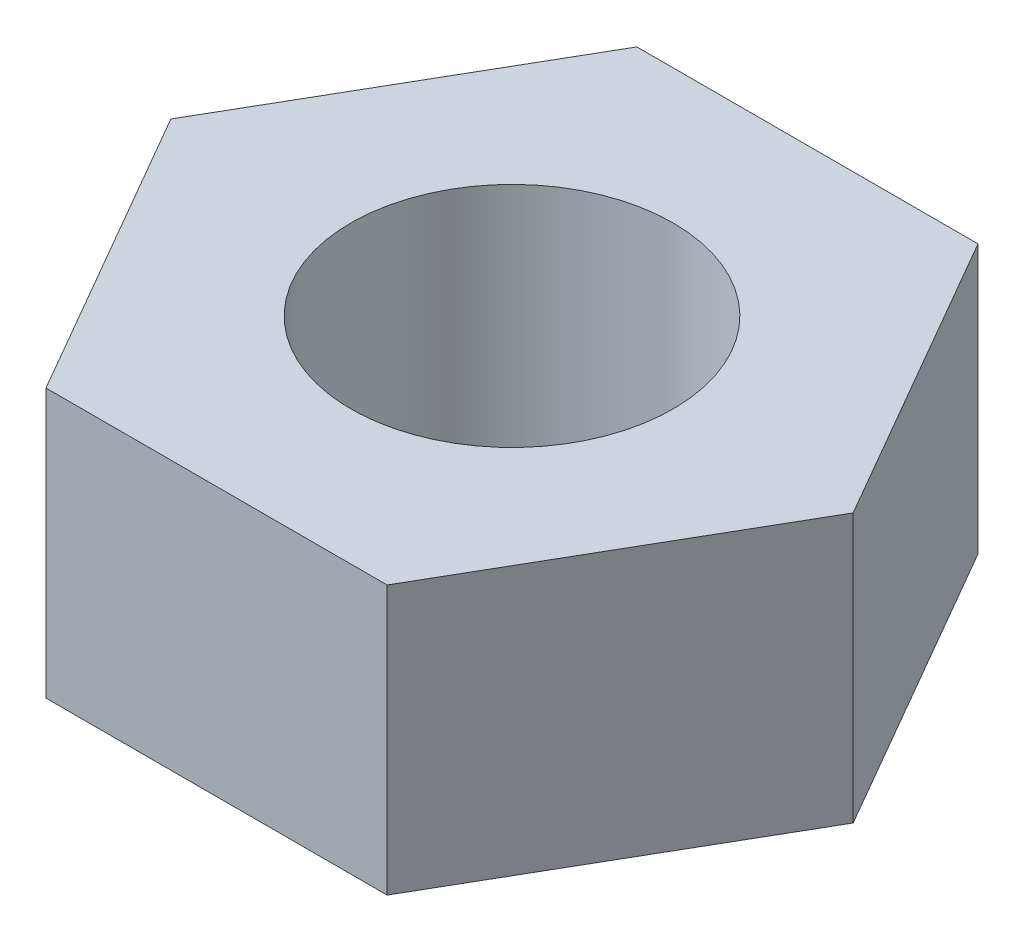
ISO-10303-21;
HEADER;
FILE_DESCRIPTION(('STEP AP214'),'2;1');
FILE_NAME('part.step','',(''),(''),'','','');
FILE_SCHEMA(('AUTOMOTIVE_DESIGN { 1 0 10303 214 1 1 1 1 }'));
ENDSEC;
DATA;
#1=APPLICATION_CONTEXT('core data for automotive mechanical design processes');
#2=APPLICATION_PROTOCOL_DEFINITION('international standard','automotive_design',2000,#1);
#3=PRODUCT_CONTEXT('',#1,'mechanical');
#4=PRODUCT('Part','Part','',(#3));
#5=PRODUCT_RELATED_PRODUCT_CATEGORY('part','',(#4));
#6=PRODUCT_DEFINITION_FORMATION('','',#4);
#7=PRODUCT_DEFINITION_CONTEXT('part definition',#1,'design');
#8=PRODUCT_DEFINITION('design','',#6,#7);
#9=PRODUCT_DEFINITION_SHAPE('','',#8);
#10=(LENGTH_UNIT() NAMED_UNIT(*) SI_UNIT(.MILLI.,.METRE.));
#11=(NAMED_UNIT(*) PLANE_ANGLE_UNIT() SI_UNIT($,.RADIAN.));
#12=(NAMED_UNIT(*) SI_UNIT($,.STERADIAN.) SOLID_ANGLE_UNIT());
#13=UNCERTAINTY_MEASURE_WITH_UNIT(LENGTH_MEASURE(1.E-05),#10,'distance_accuracy_value','');
#14=(GEOMETRIC_REPRESENTATION_CONTEXT(3) GLOBAL_UNCERTAINTY_ASSIGNED_CONTEXT((#13)) GLOBAL_UNIT_ASSIGNED_CONTEXT((#10,
#11,#12)) REPRESENTATION_CONTEXT('',''));
#15=CARTESIAN_POINT('',(0.,0.,0.));
#16=DIRECTION('',(0.,0.,1.));
#17=DIRECTION('',(1.,0.,0.));
#18=AXIS2_PLACEMENT_3D('',#15,#16,#17);
#19=CARTESIAN_POINT('',(1.5877132402715,2.5,2.74999999999998));
#20=DIRECTION('',(-0.866025403784442,0.,-0.499999999999995));
#21=DIRECTION('',(-0.499999999999995,0.,0.866025403784442));
#22=AXIS2_PLACEMENT_3D('',#19,#20,#21);
#23=PLANE('',#22);
#24=DIRECTION('',(0.499999999999995,0.,-0.866025403784441));
#25=VECTOR('',#24,1.);
#26=CARTESIAN_POINT('',(1.5877132402715,0.,2.74999999999998));
#27=LINE('',#26,#25);
#28=CARTESIAN_POINT('',(1.5877132402715,0.,2.74999999999998));
#29=VERTEX_POINT('',#28);
#30=CARTESIAN_POINT('',(3.17542648054294,0.,0.));
#31=VERTEX_POINT('',#30);
#32=EDGE_CURVE('E132',#29,#31,#27,.T.);
#33=ORIENTED_EDGE('',*,*,#32,.T.);
#34=DIRECTION('',(0.,-1.,0.));
#35=VECTOR('',#34,1.);
#36=CARTESIAN_POINT('',(3.17542648054294,2.5,0.));
#37=LINE('',#36,#35);
#38=CARTESIAN_POINT('',(3.17542648054294,2.5,0.));
#39=VERTEX_POINT('',#38);
#40=EDGE_CURVE('E11',#39,#31,#37,.T.);
#41=ORIENTED_EDGE('',*,*,#40,.F.);
#42=DIRECTION('',(0.499999999999995,0.,-0.866025403784441));
#43=VECTOR('',#42,1.);
#44=CARTESIAN_POINT('',(1.5877132402715,2.5,2.74999999999998));
#45=LINE('',#44,#43);
#46=CARTESIAN_POINT('',(1.5877132402715,2.5,2.74999999999998));
#47=VERTEX_POINT('',#46);
#48=EDGE_CURVE('E149',#47,#39,#45,.T.);
#49=ORIENTED_EDGE('',*,*,#48,.F.);
#50=DIRECTION('',(0.,-1.,0.));
#51=VECTOR('',#50,1.);
#52=CARTESIAN_POINT('',(1.5877132402715,2.5,2.74999999999998));
#53=LINE('',#52,#51);
#54=EDGE_CURVE('E128',#47,#29,#53,.T.);
#55=ORIENTED_EDGE('',*,*,#54,.T.);
#56=EDGE_LOOP('',(#33,#41,#49,#55));
#57=FACE_BOUND('',#56,.T.);
#58=ADVANCED_FACE('F43',(#57),#23,.F.);
#59=CARTESIAN_POINT('',(3.17542648054294,2.5,0.));
#60=DIRECTION('',(-0.866025403784438,0.,0.500000000000001));
#61=DIRECTION('',(0.500000000000001,0.,0.866025403784438));
#62=AXIS2_PLACEMENT_3D('',#59,#60,#61);
#63=PLANE('',#62);
#64=DIRECTION('',(-0.500000000000001,0.,-0.866025403784438));
#65=VECTOR('',#64,1.);
#66=CARTESIAN_POINT('',(3.17542648054294,0.,0.));
#67=LINE('',#66,#65);
#68=CARTESIAN_POINT('',(1.58771324027147,0.,-2.75000000000001));
#69=VERTEX_POINT('',#68);
#70=EDGE_CURVE('E136',#31,#69,#67,.T.);
#71=ORIENTED_EDGE('',*,*,#70,.T.);
#72=DIRECTION('',(0.,-1.,0.));
#73=VECTOR('',#72,1.);
#74=CARTESIAN_POINT('',(1.58771324027147,2.5,-2.75000000000001));
#75=LINE('',#74,#73);
#76=CARTESIAN_POINT('',(1.58771324027147,2.5,-2.75000000000001));
#77=VERTEX_POINT('',#76);
#78=EDGE_CURVE('E52',#77,#69,#75,.T.);
#79=ORIENTED_EDGE('',*,*,#78,.F.);
#80=DIRECTION('',(-0.500000000000001,0.,-0.866025403784438));
#81=VECTOR('',#80,1.);
#82=CARTESIAN_POINT('',(3.17542648054294,2.5,0.));
#83=LINE('',#82,#81);
#84=EDGE_CURVE('E97',#39,#77,#83,.T.);
#85=ORIENTED_EDGE('',*,*,#84,.F.);
#86=ORIENTED_EDGE('',*,*,#40,.T.);
#87=EDGE_LOOP('',(#71,#79,#85,#86));
#88=FACE_BOUND('',#87,.T.);
#89=ADVANCED_FACE('F178',(#88),#63,.F.);
#90=CARTESIAN_POINT('',(1.58771324027147,2.5,-2.75000000000001));
#91=DIRECTION('',(0.,0.,1.));
#92=DIRECTION('',(1.,0.,0.));
#93=AXIS2_PLACEMENT_3D('',#90,#91,#92);
#94=PLANE('',#93);
#95=DIRECTION('',(-1.,0.,0.));
#96=VECTOR('',#95,1.);
#97=CARTESIAN_POINT('',(1.58771324027147,0.,-2.75000000000001));
#98=LINE('',#97,#96);
#99=CARTESIAN_POINT('',(-1.58771324027148,0.,-2.75));
#100=VERTEX_POINT('',#99);
#101=EDGE_CURVE('E140',#69,#100,#98,.T.);
#102=ORIENTED_EDGE('',*,*,#101,.T.);
#103=DIRECTION('',(0.,-1.,0.));
#104=VECTOR('',#103,1.);
#105=CARTESIAN_POINT('',(-1.58771324027148,2.5,-2.75));
#106=LINE('',#105,#104);
#107=CARTESIAN_POINT('',(-1.58771324027148,2.5,-2.75));
#108=VERTEX_POINT('',#107);
#109=EDGE_CURVE('E121',#108,#100,#106,.T.);
#110=ORIENTED_EDGE('',*,*,#109,.F.);
#111=DIRECTION('',(-1.,0.,0.));
#112=VECTOR('',#111,1.);
#113=CARTESIAN_POINT('',(1.58771324027147,2.5,-2.75000000000001));
#114=LINE('',#113,#112);
#115=EDGE_CURVE('E110',#77,#108,#114,.T.);
#116=ORIENTED_EDGE('',*,*,#115,.F.);
#117=ORIENTED_EDGE('',*,*,#78,.T.);
#118=EDGE_LOOP('',(#102,#110,#116,#117));
#119=FACE_BOUND('',#118,.T.);
#120=ADVANCED_FACE('F159',(#119),#94,.F.);
#121=CARTESIAN_POINT('',(-1.58771324027148,2.5,-2.75));
#122=DIRECTION('',(0.866025403784442,0.,0.499999999999995));
#123=DIRECTION('',(0.499999999999995,0.,-0.866025403784442));
#124=AXIS2_PLACEMENT_3D('',#121,#122,#123);
#125=PLANE('',#124);
#126=DIRECTION('',(-0.499999999999995,0.,0.866025403784442));
#127=VECTOR('',#126,1.);
#128=CARTESIAN_POINT('',(-1.58771324027148,0.,-2.75));
#129=LINE('',#128,#127);
#130=CARTESIAN_POINT('',(-3.17542648054294,0.,0.));
#131=VERTEX_POINT('',#130);
#132=EDGE_CURVE('E119',#100,#131,#129,.T.);
#133=ORIENTED_EDGE('',*,*,#132,.T.);
#134=DIRECTION('',(0.,-1.,0.));
#135=VECTOR('',#134,1.);
#136=CARTESIAN_POINT('',(-3.17542648054294,2.5,0.));
#137=LINE('',#136,#135);
#138=CARTESIAN_POINT('',(-3.17542648054294,2.5,0.));
#139=VERTEX_POINT('',#138);
#140=EDGE_CURVE('E116',#139,#131,#137,.T.);
#141=ORIENTED_EDGE('',*,*,#140,.F.);
#142=DIRECTION('',(-0.499999999999995,0.,0.866025403784442));
#143=VECTOR('',#142,1.);
#144=CARTESIAN_POINT('',(-1.58771324027148,2.5,-2.75));
#145=LINE('',#144,#143);
#146=EDGE_CURVE('E104',#108,#139,#145,.T.);
#147=ORIENTED_EDGE('',*,*,#146,.F.);
#148=ORIENTED_EDGE('',*,*,#109,.T.);
#149=EDGE_LOOP('',(#133,#141,#147,#148));
#150=FACE_BOUND('',#149,.T.);
#151=ADVANCED_FACE('F117',(#150),#125,.F.);
#152=CARTESIAN_POINT('',(-3.17542648054294,2.5,0.));
#153=DIRECTION('',(0.866025403784435,0.,-0.500000000000007));
#154=DIRECTION('',(-0.500000000000007,0.,-0.866025403784435));
#155=AXIS2_PLACEMENT_3D('',#152,#153,#154);
#156=PLANE('',#155);
#157=DIRECTION('',(0.500000000000007,0.,0.866025403784435));
#158=VECTOR('',#157,1.);
#159=CARTESIAN_POINT('',(-3.17542648054294,0.,0.));
#160=LINE('',#159,#158);
#161=CARTESIAN_POINT('',(-1.58771324027145,0.,2.75000000000002));
#162=VERTEX_POINT('',#161);
#163=EDGE_CURVE('E83',#131,#162,#160,.T.);
#164=ORIENTED_EDGE('',*,*,#163,.T.);
#165=DIRECTION('',(0.,-1.,0.));
#166=VECTOR('',#165,1.);
#167=CARTESIAN_POINT('',(-1.58771324027145,2.5,2.75000000000002));
#168=LINE('',#167,#166);
#169=CARTESIAN_POINT('',(-1.58771324027145,2.5,2.75000000000002));
#170=VERTEX_POINT('',#169);
#171=EDGE_CURVE('E122',#170,#162,#168,.T.);
#172=ORIENTED_EDGE('',*,*,#171,.F.);
#173=DIRECTION('',(0.500000000000007,0.,0.866025403784435));
#174=VECTOR('',#173,1.);
#175=CARTESIAN_POINT('',(-3.17542648054294,2.5,0.));
#176=LINE('',#175,#174);
#177=EDGE_CURVE('E108',#139,#170,#176,.T.);
#178=ORIENTED_EDGE('',*,*,#177,.F.);
#179=ORIENTED_EDGE('',*,*,#140,.T.);
#180=EDGE_LOOP('',(#164,#172,#178,#179));
#181=FACE_BOUND('',#180,.T.);
#182=ADVANCED_FACE('F124',(#181),#156,.F.);
#183=CARTESIAN_POINT('',(-1.58771324027145,2.5,2.75000000000002));
#184=DIRECTION('',(0.,0.,-1.));
#185=DIRECTION('',(-1.,0.,0.));
#186=AXIS2_PLACEMENT_3D('',#183,#184,#185);
#187=PLANE('',#186);
#188=DIRECTION('',(1.,0.,0.));
#189=VECTOR('',#188,1.);
#190=CARTESIAN_POINT('',(-1.58771324027145,0.,2.75000000000002));
#191=LINE('',#190,#189);
#192=EDGE_CURVE('E89',#162,#29,#191,.T.);
#193=ORIENTED_EDGE('',*,*,#192,.T.);
#194=ORIENTED_EDGE('',*,*,#54,.F.);
#195=DIRECTION('',(1.,0.,0.));
#196=VECTOR('',#195,1.);
#197=CARTESIAN_POINT('',(-1.58771324027145,2.5,2.75000000000002));
#198=LINE('',#197,#196);
#199=EDGE_CURVE('E60',#170,#47,#198,.T.);
#200=ORIENTED_EDGE('',*,*,#199,.F.);
#201=ORIENTED_EDGE('',*,*,#171,.T.);
#202=EDGE_LOOP('',(#193,#194,#200,#201));
#203=FACE_BOUND('',#202,.T.);
#204=ADVANCED_FACE('F166',(#203),#187,.F.);
#205=CARTESIAN_POINT('',(0.,2.5,0.));
#206=DIRECTION('',(0.,1.,0.));
#207=DIRECTION('',(0.,0.,1.));
#208=AXIS2_PLACEMENT_3D('',#205,#206,#207);
#209=PLANE('',#208);
#210=CARTESIAN_POINT('',(0.,2.5,0.));
#211=DIRECTION('',(0.,-1.,0.));
#212=DIRECTION('',(0.,0.,-1.));
#213=AXIS2_PLACEMENT_3D('',#210,#211,#212);
#214=CIRCLE('',#213,1.5);
#215=CARTESIAN_POINT('',(0.,2.5,-1.5));
#216=VERTEX_POINT('',#215);
#217=EDGE_CURVE('E137',#216,#216,#214,.T.);
#218=ORIENTED_EDGE('',*,*,#217,.T.);
#219=EDGE_LOOP('',(#218));
#220=FACE_BOUND('',#219,.T.);
#221=ORIENTED_EDGE('',*,*,#48,.T.);
#222=ORIENTED_EDGE('',*,*,#84,.T.);
#223=ORIENTED_EDGE('',*,*,#115,.T.);
#224=ORIENTED_EDGE('',*,*,#146,.T.);
#225=ORIENTED_EDGE('',*,*,#177,.T.);
#226=ORIENTED_EDGE('',*,*,#199,.T.);
#227=EDGE_LOOP('',(#221,#222,#223,#224,#225,#226));
#228=FACE_BOUND('',#227,.T.);
#229=ADVANCED_FACE('F106',(#220,#228),#209,.T.);
#230=CARTESIAN_POINT('',(0.,0.,0.));
#231=DIRECTION('',(0.,1.,0.));
#232=DIRECTION('',(0.,0.,1.));
#233=AXIS2_PLACEMENT_3D('',#230,#231,#232);
#234=PLANE('',#233);
#235=CARTESIAN_POINT('',(0.,0.,0.));
#236=DIRECTION('',(0.,-1.,0.));
#237=DIRECTION('',(0.,0.,-1.));
#238=AXIS2_PLACEMENT_3D('',#235,#236,#237);
#239=CIRCLE('',#238,1.5);
#240=CARTESIAN_POINT('',(0.,0.,-1.5));
#241=VERTEX_POINT('',#240);
#242=EDGE_CURVE('E265',#241,#241,#239,.T.);
#243=ORIENTED_EDGE('',*,*,#242,.F.);
#244=EDGE_LOOP('',(#243));
#245=FACE_BOUND('',#244,.T.);
#246=ORIENTED_EDGE('',*,*,#32,.F.);
#247=ORIENTED_EDGE('',*,*,#192,.F.);
#248=ORIENTED_EDGE('',*,*,#163,.F.);
#249=ORIENTED_EDGE('',*,*,#132,.F.);
#250=ORIENTED_EDGE('',*,*,#101,.F.);
#251=ORIENTED_EDGE('',*,*,#70,.F.);
#252=EDGE_LOOP('',(#246,#247,#248,#249,#250,#251));
#253=FACE_BOUND('',#252,.T.);
#254=ADVANCED_FACE('F162',(#245,#253),#234,.F.);
#255=CARTESIAN_POINT('',(0.,2.5,0.));
#256=DIRECTION('',(0.,-1.,0.));
#257=DIRECTION('',(0.,0.,-1.));
#258=AXIS2_PLACEMENT_3D('',#255,#256,#257);
#259=CYLINDRICAL_SURFACE('',#258,1.5);
#260=ORIENTED_EDGE('',*,*,#217,.F.);
#261=EDGE_LOOP('',(#260));
#262=FACE_BOUND('',#261,.T.);
#263=ORIENTED_EDGE('',*,*,#242,.T.);
#264=EDGE_LOOP('',(#263));
#265=FACE_BOUND('',#264,.T.);
#266=ADVANCED_FACE('F218',(#262,#265),#259,.F.);
#267=CLOSED_SHELL('',(#58,#89,#120,#151,#182,#204,#229,#254,#266));
#268=MANIFOLD_SOLID_BREP('B2',#267);
#269=ADVANCED_BREP_SHAPE_REPRESENTATION('',(#18,#268),#14);
#270=SHAPE_DEFINITION_REPRESENTATION(#9,#269);
ENDSEC;
END-ISO-10303-21;
